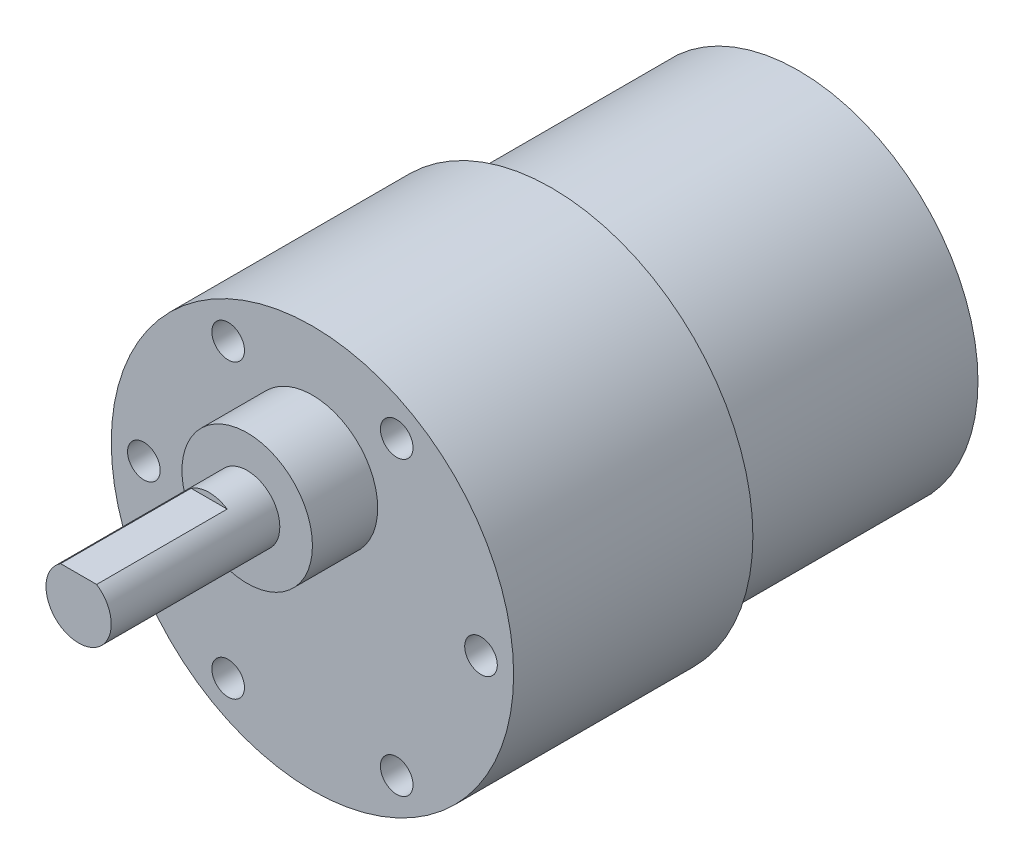
ISO-10303-21;
HEADER;
FILE_DESCRIPTION(('STEP AP214'),'2;1');
FILE_NAME('part.step','',(''),(''),'','','');
FILE_SCHEMA(('AUTOMOTIVE_DESIGN { 1 0 10303 214 1 1 1 1 }'));
ENDSEC;
DATA;
#1=APPLICATION_CONTEXT('core data for automotive mechanical design processes');
#2=APPLICATION_PROTOCOL_DEFINITION('international standard','automotive_design',2000,#1);
#3=PRODUCT_CONTEXT('',#1,'mechanical');
#4=PRODUCT('Part','Part','',(#3));
#5=PRODUCT_RELATED_PRODUCT_CATEGORY('part','',(#4));
#6=PRODUCT_DEFINITION_FORMATION('','',#4);
#7=PRODUCT_DEFINITION_CONTEXT('part definition',#1,'design');
#8=PRODUCT_DEFINITION('design','',#6,#7);
#9=PRODUCT_DEFINITION_SHAPE('','',#8);
#10=(LENGTH_UNIT() NAMED_UNIT(*) SI_UNIT(.MILLI.,.METRE.));
#11=(NAMED_UNIT(*) PLANE_ANGLE_UNIT() SI_UNIT($,.RADIAN.));
#12=(NAMED_UNIT(*) SI_UNIT($,.STERADIAN.) SOLID_ANGLE_UNIT());
#13=UNCERTAINTY_MEASURE_WITH_UNIT(LENGTH_MEASURE(1.E-05),#10,'distance_accuracy_value','');
#14=(GEOMETRIC_REPRESENTATION_CONTEXT(3) GLOBAL_UNCERTAINTY_ASSIGNED_CONTEXT((#13)) GLOBAL_UNIT_ASSIGNED_CONTEXT((#10,
#11,#12)) REPRESENTATION_CONTEXT('',''));
#15=CARTESIAN_POINT('',(0.,0.,0.));
#16=DIRECTION('',(0.,0.,1.));
#17=DIRECTION('',(1.,0.,0.));
#18=AXIS2_PLACEMENT_3D('',#15,#16,#17);
#19=CARTESIAN_POINT('',(0.,0.,22.));
#20=DIRECTION('',(0.,0.,-1.));
#21=DIRECTION('',(-1.,0.,0.));
#22=AXIS2_PLACEMENT_3D('',#19,#20,#21);
#23=CYLINDRICAL_SURFACE('',#22,18.5);
#24=CARTESIAN_POINT('',(0.,0.,22.));
#25=DIRECTION('',(0.,0.,1.));
#26=DIRECTION('',(1.,0.,0.));
#27=AXIS2_PLACEMENT_3D('',#24,#25,#26);
#28=CIRCLE('',#27,18.5);
#29=CARTESIAN_POINT('',(18.5,0.,22.));
#30=VERTEX_POINT('',#29);
#31=EDGE_CURVE('E64',#30,#30,#28,.T.);
#32=ORIENTED_EDGE('',*,*,#31,.F.);
#33=EDGE_LOOP('',(#32));
#34=FACE_BOUND('',#33,.T.);
#35=CARTESIAN_POINT('',(0.,0.,0.));
#36=DIRECTION('',(0.,0.,1.));
#37=DIRECTION('',(1.,0.,0.));
#38=AXIS2_PLACEMENT_3D('',#35,#36,#37);
#39=CIRCLE('',#38,18.5);
#40=CARTESIAN_POINT('',(18.5,0.,0.));
#41=VERTEX_POINT('',#40);
#42=EDGE_CURVE('E85',#41,#41,#39,.T.);
#43=ORIENTED_EDGE('',*,*,#42,.T.);
#44=EDGE_LOOP('',(#43));
#45=FACE_BOUND('',#44,.T.);
#46=ADVANCED_FACE('F34',(#34,#45),#23,.T.);
#47=CARTESIAN_POINT('',(0.,0.,22.));
#48=DIRECTION('',(0.,0.,1.));
#49=DIRECTION('',(1.,0.,0.));
#50=AXIS2_PLACEMENT_3D('',#47,#48,#49);
#51=PLANE('',#50);
#52=CARTESIAN_POINT('',(7.74999999999997,-13.4233937586588,22.));
#53=DIRECTION('',(0.,0.,1.));
#54=DIRECTION('',(1.,0.,0.));
#55=AXIS2_PLACEMENT_3D('',#52,#53,#54);
#56=CIRCLE('',#55,1.5);
#57=CARTESIAN_POINT('',(9.24999999999997,-13.4233937586588,22.));
#58=VERTEX_POINT('',#57);
#59=EDGE_CURVE('E376',#58,#58,#56,.T.);
#60=ORIENTED_EDGE('',*,*,#59,.F.);
#61=EDGE_LOOP('',(#60));
#62=FACE_BOUND('',#61,.T.);
#63=CARTESIAN_POINT('',(-7.75000000000006,-13.4233937586588,22.));
#64=DIRECTION('',(0.,0.,1.));
#65=DIRECTION('',(1.,0.,0.));
#66=AXIS2_PLACEMENT_3D('',#63,#64,#65);
#67=CIRCLE('',#66,1.5);
#68=CARTESIAN_POINT('',(-6.25000000000006,-13.4233937586588,22.));
#69=VERTEX_POINT('',#68);
#70=EDGE_CURVE('E370',#69,#69,#67,.T.);
#71=ORIENTED_EDGE('',*,*,#70,.F.);
#72=EDGE_LOOP('',(#71));
#73=FACE_BOUND('',#72,.T.);
#74=CARTESIAN_POINT('',(-15.5,1.08235921504137E-13,22.));
#75=DIRECTION('',(0.,0.,1.));
#76=DIRECTION('',(1.,0.,0.));
#77=AXIS2_PLACEMENT_3D('',#74,#75,#76);
#78=CIRCLE('',#77,1.5);
#79=CARTESIAN_POINT('',(-14.,1.08235921504137E-13,22.));
#80=VERTEX_POINT('',#79);
#81=EDGE_CURVE('E364',#80,#80,#78,.T.);
#82=ORIENTED_EDGE('',*,*,#81,.F.);
#83=EDGE_LOOP('',(#82));
#84=FACE_BOUND('',#83,.T.);
#85=CARTESIAN_POINT('',(-7.74999999999987,13.4233937586589,22.));
#86=DIRECTION('',(0.,0.,1.));
#87=DIRECTION('',(1.,0.,0.));
#88=AXIS2_PLACEMENT_3D('',#85,#86,#87);
#89=CIRCLE('',#88,1.5);
#90=CARTESIAN_POINT('',(-6.24999999999987,13.4233937586589,22.));
#91=VERTEX_POINT('',#90);
#92=EDGE_CURVE('E358',#91,#91,#89,.T.);
#93=ORIENTED_EDGE('',*,*,#92,.F.);
#94=EDGE_LOOP('',(#93));
#95=FACE_BOUND('',#94,.T.);
#96=CARTESIAN_POINT('',(7.75000000000016,13.4233937586587,22.));
#97=DIRECTION('',(0.,0.,1.));
#98=DIRECTION('',(1.,0.,0.));
#99=AXIS2_PLACEMENT_3D('',#96,#97,#98);
#100=CIRCLE('',#99,1.5);
#101=CARTESIAN_POINT('',(9.25000000000016,13.4233937586587,22.));
#102=VERTEX_POINT('',#101);
#103=EDGE_CURVE('E351',#102,#102,#100,.T.);
#104=ORIENTED_EDGE('',*,*,#103,.F.);
#105=EDGE_LOOP('',(#104));
#106=FACE_BOUND('',#105,.T.);
#107=CARTESIAN_POINT('',(15.5,0.,22.));
#108=DIRECTION('',(0.,0.,1.));
#109=DIRECTION('',(1.,0.,0.));
#110=AXIS2_PLACEMENT_3D('',#107,#108,#109);
#111=CIRCLE('',#110,1.5);
#112=CARTESIAN_POINT('',(17.,0.,22.));
#113=VERTEX_POINT('',#112);
#114=EDGE_CURVE('E345',#113,#113,#111,.T.);
#115=ORIENTED_EDGE('',*,*,#114,.F.);
#116=EDGE_LOOP('',(#115));
#117=FACE_BOUND('',#116,.T.);
#118=CARTESIAN_POINT('',(0.,7.,22.));
#119=DIRECTION('',(0.,0.,1.));
#120=DIRECTION('',(1.,0.,0.));
#121=AXIS2_PLACEMENT_3D('',#118,#119,#120);
#122=CIRCLE('',#121,6.);
#123=CARTESIAN_POINT('',(6.,7.,22.));
#124=VERTEX_POINT('',#123);
#125=EDGE_CURVE('E74',#124,#124,#122,.T.);
#126=ORIENTED_EDGE('',*,*,#125,.F.);
#127=EDGE_LOOP('',(#126));
#128=FACE_BOUND('',#127,.T.);
#129=ORIENTED_EDGE('',*,*,#31,.T.);
#130=EDGE_LOOP('',(#129));
#131=FACE_BOUND('',#130,.T.);
#132=ADVANCED_FACE('F96',(#62,#73,#84,#95,#106,#117,#128,#131),#51,.T.);
#133=CARTESIAN_POINT('',(0.,0.,0.));
#134=DIRECTION('',(0.,0.,1.));
#135=DIRECTION('',(1.,0.,0.));
#136=AXIS2_PLACEMENT_3D('',#133,#134,#135);
#137=PLANE('',#136);
#138=CARTESIAN_POINT('',(0.,0.,0.));
#139=DIRECTION('',(0.,0.,1.));
#140=DIRECTION('',(1.,0.,0.));
#141=AXIS2_PLACEMENT_3D('',#138,#139,#140);
#142=CIRCLE('',#141,16.5);
#143=CARTESIAN_POINT('',(16.5,0.,0.));
#144=VERTEX_POINT('',#143);
#145=EDGE_CURVE('E11',#144,#144,#142,.F.);
#146=ORIENTED_EDGE('',*,*,#145,.F.);
#147=EDGE_LOOP('',(#146));
#148=FACE_BOUND('',#147,.T.);
#149=ORIENTED_EDGE('',*,*,#42,.F.);
#150=EDGE_LOOP('',(#149));
#151=FACE_BOUND('',#150,.T.);
#152=ADVANCED_FACE('F93',(#148,#151),#137,.F.);
#153=CARTESIAN_POINT('',(0.,7.,28.));
#154=DIRECTION('',(0.,0.,-1.));
#155=DIRECTION('',(-1.,0.,0.));
#156=AXIS2_PLACEMENT_3D('',#153,#154,#155);
#157=CYLINDRICAL_SURFACE('',#156,6.);
#158=CARTESIAN_POINT('',(0.,7.,28.));
#159=DIRECTION('',(0.,0.,1.));
#160=DIRECTION('',(1.,0.,0.));
#161=AXIS2_PLACEMENT_3D('',#158,#159,#160);
#162=CIRCLE('',#161,6.);
#163=CARTESIAN_POINT('',(6.,7.,28.));
#164=VERTEX_POINT('',#163);
#165=EDGE_CURVE('E78',#164,#164,#162,.T.);
#166=ORIENTED_EDGE('',*,*,#165,.F.);
#167=EDGE_LOOP('',(#166));
#168=FACE_BOUND('',#167,.T.);
#169=ORIENTED_EDGE('',*,*,#125,.T.);
#170=EDGE_LOOP('',(#169));
#171=FACE_BOUND('',#170,.T.);
#172=ADVANCED_FACE('F95',(#168,#171),#157,.T.);
#173=CARTESIAN_POINT('',(0.,7.,28.));
#174=DIRECTION('',(0.,0.,1.));
#175=DIRECTION('',(1.,0.,0.));
#176=AXIS2_PLACEMENT_3D('',#173,#174,#175);
#177=PLANE('',#176);
#178=CARTESIAN_POINT('',(0.,7.,28.));
#179=DIRECTION('',(0.,0.,1.));
#180=DIRECTION('',(1.,0.,0.));
#181=AXIS2_PLACEMENT_3D('',#178,#179,#180);
#182=CIRCLE('',#181,3.);
#183=CARTESIAN_POINT('',(3.,7.,28.));
#184=VERTEX_POINT('',#183);
#185=EDGE_CURVE('E75',#184,#184,#182,.T.);
#186=ORIENTED_EDGE('',*,*,#185,.F.);
#187=EDGE_LOOP('',(#186));
#188=FACE_BOUND('',#187,.T.);
#189=ORIENTED_EDGE('',*,*,#165,.T.);
#190=EDGE_LOOP('',(#189));
#191=FACE_BOUND('',#190,.T.);
#192=ADVANCED_FACE('F102',(#188,#191),#177,.T.);
#193=CARTESIAN_POINT('',(0.,7.,43.5));
#194=DIRECTION('',(0.,0.,-1.));
#195=DIRECTION('',(-1.,0.,0.));
#196=AXIS2_PLACEMENT_3D('',#193,#194,#195);
#197=CYLINDRICAL_SURFACE('',#196,3.);
#198=CARTESIAN_POINT('',(0.,7.,43.5));
#199=DIRECTION('',(0.,0.,1.));
#200=DIRECTION('',(1.,0.,0.));
#201=AXIS2_PLACEMENT_3D('',#198,#199,#200);
#202=CIRCLE('',#201,3.);
#203=CARTESIAN_POINT('',(-1.6583123951777,9.5,43.5));
#204=VERTEX_POINT('',#203);
#205=CARTESIAN_POINT('',(1.6583123951777,9.5,43.5));
#206=VERTEX_POINT('',#205);
#207=EDGE_CURVE('E70',#204,#206,#202,.T.);
#208=ORIENTED_EDGE('',*,*,#207,.F.);
#209=DIRECTION('',(0.,0.,-1.));
#210=VECTOR('',#209,1.);
#211=CARTESIAN_POINT('',(-1.6583123951777,9.5,43.5));
#212=LINE('',#211,#210);
#213=CARTESIAN_POINT('',(-1.6583123951777,9.5,31.5));
#214=VERTEX_POINT('',#213);
#215=EDGE_CURVE('E48',#204,#214,#212,.T.);
#216=ORIENTED_EDGE('',*,*,#215,.T.);
#217=CARTESIAN_POINT('',(0.,7.,31.5));
#218=DIRECTION('',(0.,0.,-1.));
#219=DIRECTION('',(-1.,0.,0.));
#220=AXIS2_PLACEMENT_3D('',#217,#218,#219);
#221=CIRCLE('',#220,3.);
#222=CARTESIAN_POINT('',(1.6583123951777,9.5,31.5));
#223=VERTEX_POINT('',#222);
#224=EDGE_CURVE('E41',#214,#223,#221,.T.);
#225=ORIENTED_EDGE('',*,*,#224,.T.);
#226=DIRECTION('',(0.,0.,-1.));
#227=VECTOR('',#226,1.);
#228=CARTESIAN_POINT('',(1.6583123951777,9.5,43.5));
#229=LINE('',#228,#227);
#230=EDGE_CURVE('E53',#223,#206,#229,.F.);
#231=ORIENTED_EDGE('',*,*,#230,.T.);
#232=EDGE_LOOP('',(#208,#216,#225,#231));
#233=FACE_BOUND('',#232,.T.);
#234=ORIENTED_EDGE('',*,*,#185,.T.);
#235=EDGE_LOOP('',(#234));
#236=FACE_BOUND('',#235,.T.);
#237=ADVANCED_FACE('F68',(#233,#236),#197,.T.);
#238=CARTESIAN_POINT('',(0.,7.,43.5));
#239=DIRECTION('',(0.,0.,1.));
#240=DIRECTION('',(1.,0.,0.));
#241=AXIS2_PLACEMENT_3D('',#238,#239,#240);
#242=PLANE('',#241);
#243=DIRECTION('',(1.,0.,0.));
#244=VECTOR('',#243,1.);
#245=CARTESIAN_POINT('',(0.,9.5,43.5));
#246=LINE('',#245,#244);
#247=EDGE_CURVE('E59',#204,#206,#246,.T.);
#248=ORIENTED_EDGE('',*,*,#247,.F.);
#249=ORIENTED_EDGE('',*,*,#207,.T.);
#250=EDGE_LOOP('',(#248,#249));
#251=FACE_BOUND('',#250,.T.);
#252=ADVANCED_FACE('F73',(#251),#242,.T.);
#253=CARTESIAN_POINT('',(0.,0.,31.5));
#254=DIRECTION('',(0.,0.,-1.));
#255=DIRECTION('',(-1.,0.,0.));
#256=AXIS2_PLACEMENT_3D('',#253,#254,#255);
#257=PLANE('',#256);
#258=DIRECTION('',(1.,0.,0.));
#259=VECTOR('',#258,1.);
#260=CARTESIAN_POINT('',(-3.34095000926684,9.5,31.5));
#261=LINE('',#260,#259);
#262=EDGE_CURVE('E71',#214,#223,#261,.T.);
#263=ORIENTED_EDGE('',*,*,#262,.T.);
#264=ORIENTED_EDGE('',*,*,#224,.F.);
#265=EDGE_LOOP('',(#263,#264));
#266=FACE_BOUND('',#265,.T.);
#267=ADVANCED_FACE('F295',(#266),#257,.F.);
#268=CARTESIAN_POINT('',(-3.34095000926684,9.5,31.5));
#269=DIRECTION('',(0.,-1.,0.));
#270=DIRECTION('',(0.,0.,-1.));
#271=AXIS2_PLACEMENT_3D('',#268,#269,#270);
#272=PLANE('',#271);
#273=ORIENTED_EDGE('',*,*,#247,.T.);
#274=ORIENTED_EDGE('',*,*,#230,.F.);
#275=ORIENTED_EDGE('',*,*,#262,.F.);
#276=ORIENTED_EDGE('',*,*,#215,.F.);
#277=EDGE_LOOP('',(#273,#274,#275,#276));
#278=FACE_BOUND('',#277,.T.);
#279=ADVANCED_FACE('F60',(#278),#272,.F.);
#280=CARTESIAN_POINT('',(15.5,0.,16.));
#281=DIRECTION('',(0.,0.,1.));
#282=DIRECTION('',(1.,0.,0.));
#283=AXIS2_PLACEMENT_3D('',#280,#281,#282);
#284=CYLINDRICAL_SURFACE('',#283,1.5);
#285=CARTESIAN_POINT('',(15.5,0.,16.));
#286=DIRECTION('',(0.,0.,1.));
#287=DIRECTION('',(1.,0.,0.));
#288=AXIS2_PLACEMENT_3D('',#285,#286,#287);
#289=CIRCLE('',#288,1.5);
#290=CARTESIAN_POINT('',(17.,0.,16.));
#291=VERTEX_POINT('',#290);
#292=EDGE_CURVE('E342',#291,#291,#289,.T.);
#293=ORIENTED_EDGE('',*,*,#292,.F.);
#294=EDGE_LOOP('',(#293));
#295=FACE_BOUND('',#294,.T.);
#296=ORIENTED_EDGE('',*,*,#114,.T.);
#297=EDGE_LOOP('',(#296));
#298=FACE_BOUND('',#297,.T.);
#299=ADVANCED_FACE('F130',(#295,#298),#284,.F.);
#300=CARTESIAN_POINT('',(15.5,0.,16.));
#301=DIRECTION('',(0.,0.,1.));
#302=DIRECTION('',(1.,0.,0.));
#303=AXIS2_PLACEMENT_3D('',#300,#301,#302);
#304=PLANE('',#303);
#305=ORIENTED_EDGE('',*,*,#292,.T.);
#306=EDGE_LOOP('',(#305));
#307=FACE_BOUND('',#306,.T.);
#308=ADVANCED_FACE('F135',(#307),#304,.T.);
#309=CARTESIAN_POINT('',(7.75000000000016,13.4233937586587,16.));
#310=DIRECTION('',(0.,0.,1.));
#311=DIRECTION('',(1.,0.,0.));
#312=AXIS2_PLACEMENT_3D('',#309,#310,#311);
#313=CYLINDRICAL_SURFACE('',#312,1.5);
#314=CARTESIAN_POINT('',(7.75000000000016,13.4233937586587,16.));
#315=DIRECTION('',(0.,0.,1.));
#316=DIRECTION('',(1.,0.,0.));
#317=AXIS2_PLACEMENT_3D('',#314,#315,#316);
#318=CIRCLE('',#317,1.5);
#319=CARTESIAN_POINT('',(9.25000000000016,13.4233937586587,16.));
#320=VERTEX_POINT('',#319);
#321=EDGE_CURVE('E354',#320,#320,#318,.T.);
#322=ORIENTED_EDGE('',*,*,#321,.F.);
#323=EDGE_LOOP('',(#322));
#324=FACE_BOUND('',#323,.T.);
#325=ORIENTED_EDGE('',*,*,#103,.T.);
#326=EDGE_LOOP('',(#325));
#327=FACE_BOUND('',#326,.T.);
#328=ADVANCED_FACE('F145',(#324,#327),#313,.F.);
#329=CARTESIAN_POINT('',(7.75000000000016,13.4233937586587,16.));
#330=DIRECTION('',(0.,0.,1.));
#331=DIRECTION('',(1.,0.,0.));
#332=AXIS2_PLACEMENT_3D('',#329,#330,#331);
#333=PLANE('',#332);
#334=ORIENTED_EDGE('',*,*,#321,.T.);
#335=EDGE_LOOP('',(#334));
#336=FACE_BOUND('',#335,.T.);
#337=ADVANCED_FACE('F155',(#336),#333,.T.);
#338=CARTESIAN_POINT('',(-7.74999999999987,13.4233937586589,16.));
#339=DIRECTION('',(0.,0.,1.));
#340=DIRECTION('',(1.,0.,0.));
#341=AXIS2_PLACEMENT_3D('',#338,#339,#340);
#342=CYLINDRICAL_SURFACE('',#341,1.5);
#343=CARTESIAN_POINT('',(-7.74999999999987,13.4233937586589,16.));
#344=DIRECTION('',(0.,0.,1.));
#345=DIRECTION('',(1.,0.,0.));
#346=AXIS2_PLACEMENT_3D('',#343,#344,#345);
#347=CIRCLE('',#346,1.5);
#348=CARTESIAN_POINT('',(-6.24999999999987,13.4233937586589,16.));
#349=VERTEX_POINT('',#348);
#350=EDGE_CURVE('E361',#349,#349,#347,.T.);
#351=ORIENTED_EDGE('',*,*,#350,.F.);
#352=EDGE_LOOP('',(#351));
#353=FACE_BOUND('',#352,.T.);
#354=ORIENTED_EDGE('',*,*,#92,.T.);
#355=EDGE_LOOP('',(#354));
#356=FACE_BOUND('',#355,.T.);
#357=ADVANCED_FACE('F165',(#353,#356),#342,.F.);
#358=CARTESIAN_POINT('',(-7.74999999999987,13.4233937586589,16.));
#359=DIRECTION('',(0.,0.,1.));
#360=DIRECTION('',(1.,0.,0.));
#361=AXIS2_PLACEMENT_3D('',#358,#359,#360);
#362=PLANE('',#361);
#363=ORIENTED_EDGE('',*,*,#350,.T.);
#364=EDGE_LOOP('',(#363));
#365=FACE_BOUND('',#364,.T.);
#366=ADVANCED_FACE('F175',(#365),#362,.T.);
#367=CARTESIAN_POINT('',(-15.5,1.08235921504137E-13,16.));
#368=DIRECTION('',(0.,0.,1.));
#369=DIRECTION('',(1.,0.,0.));
#370=AXIS2_PLACEMENT_3D('',#367,#368,#369);
#371=CYLINDRICAL_SURFACE('',#370,1.5);
#372=CARTESIAN_POINT('',(-15.5,1.08235921504137E-13,16.));
#373=DIRECTION('',(0.,0.,1.));
#374=DIRECTION('',(1.,0.,0.));
#375=AXIS2_PLACEMENT_3D('',#372,#373,#374);
#376=CIRCLE('',#375,1.5);
#377=CARTESIAN_POINT('',(-14.,1.08235921504137E-13,16.));
#378=VERTEX_POINT('',#377);
#379=EDGE_CURVE('E367',#378,#378,#376,.T.);
#380=ORIENTED_EDGE('',*,*,#379,.F.);
#381=EDGE_LOOP('',(#380));
#382=FACE_BOUND('',#381,.T.);
#383=ORIENTED_EDGE('',*,*,#81,.T.);
#384=EDGE_LOOP('',(#383));
#385=FACE_BOUND('',#384,.T.);
#386=ADVANCED_FACE('F185',(#382,#385),#371,.F.);
#387=CARTESIAN_POINT('',(-15.5,1.08235921504137E-13,16.));
#388=DIRECTION('',(0.,0.,1.));
#389=DIRECTION('',(1.,0.,0.));
#390=AXIS2_PLACEMENT_3D('',#387,#388,#389);
#391=PLANE('',#390);
#392=ORIENTED_EDGE('',*,*,#379,.T.);
#393=EDGE_LOOP('',(#392));
#394=FACE_BOUND('',#393,.T.);
#395=ADVANCED_FACE('F195',(#394),#391,.T.);
#396=CARTESIAN_POINT('',(-7.75000000000006,-13.4233937586588,16.));
#397=DIRECTION('',(0.,0.,1.));
#398=DIRECTION('',(1.,0.,0.));
#399=AXIS2_PLACEMENT_3D('',#396,#397,#398);
#400=CYLINDRICAL_SURFACE('',#399,1.5);
#401=CARTESIAN_POINT('',(-7.75000000000006,-13.4233937586588,16.));
#402=DIRECTION('',(0.,0.,1.));
#403=DIRECTION('',(1.,0.,0.));
#404=AXIS2_PLACEMENT_3D('',#401,#402,#403);
#405=CIRCLE('',#404,1.5);
#406=CARTESIAN_POINT('',(-6.25000000000006,-13.4233937586588,16.));
#407=VERTEX_POINT('',#406);
#408=EDGE_CURVE('E373',#407,#407,#405,.T.);
#409=ORIENTED_EDGE('',*,*,#408,.F.);
#410=EDGE_LOOP('',(#409));
#411=FACE_BOUND('',#410,.T.);
#412=ORIENTED_EDGE('',*,*,#70,.T.);
#413=EDGE_LOOP('',(#412));
#414=FACE_BOUND('',#413,.T.);
#415=ADVANCED_FACE('F205',(#411,#414),#400,.F.);
#416=CARTESIAN_POINT('',(-7.75000000000006,-13.4233937586588,16.));
#417=DIRECTION('',(0.,0.,1.));
#418=DIRECTION('',(1.,0.,0.));
#419=AXIS2_PLACEMENT_3D('',#416,#417,#418);
#420=PLANE('',#419);
#421=ORIENTED_EDGE('',*,*,#408,.T.);
#422=EDGE_LOOP('',(#421));
#423=FACE_BOUND('',#422,.T.);
#424=ADVANCED_FACE('F215',(#423),#420,.T.);
#425=CARTESIAN_POINT('',(7.74999999999997,-13.4233937586588,16.));
#426=DIRECTION('',(0.,0.,1.));
#427=DIRECTION('',(1.,0.,0.));
#428=AXIS2_PLACEMENT_3D('',#425,#426,#427);
#429=CYLINDRICAL_SURFACE('',#428,1.5);
#430=CARTESIAN_POINT('',(7.74999999999997,-13.4233937586588,16.));
#431=DIRECTION('',(0.,0.,1.));
#432=DIRECTION('',(1.,0.,0.));
#433=AXIS2_PLACEMENT_3D('',#430,#431,#432);
#434=CIRCLE('',#433,1.5);
#435=CARTESIAN_POINT('',(9.24999999999997,-13.4233937586588,16.));
#436=VERTEX_POINT('',#435);
#437=EDGE_CURVE('E349',#436,#436,#434,.T.);
#438=ORIENTED_EDGE('',*,*,#437,.F.);
#439=EDGE_LOOP('',(#438));
#440=FACE_BOUND('',#439,.T.);
#441=ORIENTED_EDGE('',*,*,#59,.T.);
#442=EDGE_LOOP('',(#441));
#443=FACE_BOUND('',#442,.T.);
#444=ADVANCED_FACE('F225',(#440,#443),#429,.F.);
#445=CARTESIAN_POINT('',(7.74999999999997,-13.4233937586588,16.));
#446=DIRECTION('',(0.,0.,1.));
#447=DIRECTION('',(1.,0.,0.));
#448=AXIS2_PLACEMENT_3D('',#445,#446,#447);
#449=PLANE('',#448);
#450=ORIENTED_EDGE('',*,*,#437,.T.);
#451=EDGE_LOOP('',(#450));
#452=FACE_BOUND('',#451,.T.);
#453=ADVANCED_FACE('F235',(#452),#449,.T.);
#454=CARTESIAN_POINT('',(0.,0.,-22.7));
#455=DIRECTION('',(0.,0.,1.));
#456=DIRECTION('',(1.,0.,0.));
#457=AXIS2_PLACEMENT_3D('',#454,#455,#456);
#458=CYLINDRICAL_SURFACE('',#457,16.5);
#459=CARTESIAN_POINT('',(0.,0.,-22.7));
#460=DIRECTION('',(0.,0.,-1.));
#461=DIRECTION('',(-1.,0.,0.));
#462=AXIS2_PLACEMENT_3D('',#459,#460,#461);
#463=CIRCLE('',#462,16.5);
#464=CARTESIAN_POINT('',(-16.5,0.,-22.7));
#465=VERTEX_POINT('',#464);
#466=EDGE_CURVE('E355',#465,#465,#463,.T.);
#467=ORIENTED_EDGE('',*,*,#466,.F.);
#468=EDGE_LOOP('',(#467));
#469=FACE_BOUND('',#468,.T.);
#470=ORIENTED_EDGE('',*,*,#145,.T.);
#471=EDGE_LOOP('',(#470));
#472=FACE_BOUND('',#471,.T.);
#473=ADVANCED_FACE('F244',(#469,#472),#458,.T.);
#474=CARTESIAN_POINT('',(0.,0.,-22.7));
#475=DIRECTION('',(0.,0.,-1.));
#476=DIRECTION('',(-1.,0.,0.));
#477=AXIS2_PLACEMENT_3D('',#474,#475,#476);
#478=PLANE('',#477);
#479=CARTESIAN_POINT('',(0.,0.,-22.7));
#480=DIRECTION('',(0.,0.,-1.));
#481=DIRECTION('',(-1.,0.,0.));
#482=AXIS2_PLACEMENT_3D('',#479,#480,#481);
#483=CIRCLE('',#482,8.);
#484=CARTESIAN_POINT('',(-8.,0.,-22.7));
#485=VERTEX_POINT('',#484);
#486=EDGE_CURVE('E384',#485,#485,#483,.T.);
#487=ORIENTED_EDGE('',*,*,#486,.F.);
#488=EDGE_LOOP('',(#487));
#489=FACE_BOUND('',#488,.T.);
#490=ORIENTED_EDGE('',*,*,#466,.T.);
#491=EDGE_LOOP('',(#490));
#492=FACE_BOUND('',#491,.T.);
#493=ADVANCED_FACE('F259',(#489,#492),#478,.T.);
#494=CARTESIAN_POINT('',(0.,0.,-28.7));
#495=DIRECTION('',(0.,0.,1.));
#496=DIRECTION('',(1.,0.,0.));
#497=AXIS2_PLACEMENT_3D('',#494,#495,#496);
#498=CYLINDRICAL_SURFACE('',#497,8.);
#499=CARTESIAN_POINT('',(0.,0.,-28.7));
#500=DIRECTION('',(0.,0.,-1.));
#501=DIRECTION('',(-1.,0.,0.));
#502=AXIS2_PLACEMENT_3D('',#499,#500,#501);
#503=CIRCLE('',#502,8.);
#504=CARTESIAN_POINT('',(-8.,0.,-28.7));
#505=VERTEX_POINT('',#504);
#506=EDGE_CURVE('E383',#505,#505,#503,.T.);
#507=ORIENTED_EDGE('',*,*,#506,.F.);
#508=EDGE_LOOP('',(#507));
#509=FACE_BOUND('',#508,.T.);
#510=ORIENTED_EDGE('',*,*,#486,.T.);
#511=EDGE_LOOP('',(#510));
#512=FACE_BOUND('',#511,.T.);
#513=ADVANCED_FACE('F269',(#509,#512),#498,.T.);
#514=CARTESIAN_POINT('',(0.,0.,-28.7));
#515=DIRECTION('',(0.,0.,-1.));
#516=DIRECTION('',(-1.,0.,0.));
#517=AXIS2_PLACEMENT_3D('',#514,#515,#516);
#518=PLANE('',#517);
#519=ORIENTED_EDGE('',*,*,#506,.T.);
#520=EDGE_LOOP('',(#519));
#521=FACE_BOUND('',#520,.T.);
#522=ADVANCED_FACE('F279',(#521),#518,.T.);
#523=CLOSED_SHELL('',(#46,#132,#152,#172,#192,#237,#252,#267,#279,#299,#308,#328,#337,#357,#366,
#386,#395,#415,#424,#444,#453,#473,#493,#513,#522));
#524=MANIFOLD_SOLID_BREP('B2',#523);
#525=ADVANCED_BREP_SHAPE_REPRESENTATION('',(#18,#524),#14);
#526=SHAPE_DEFINITION_REPRESENTATION(#9,#525);
ENDSEC;
END-ISO-10303-21;
